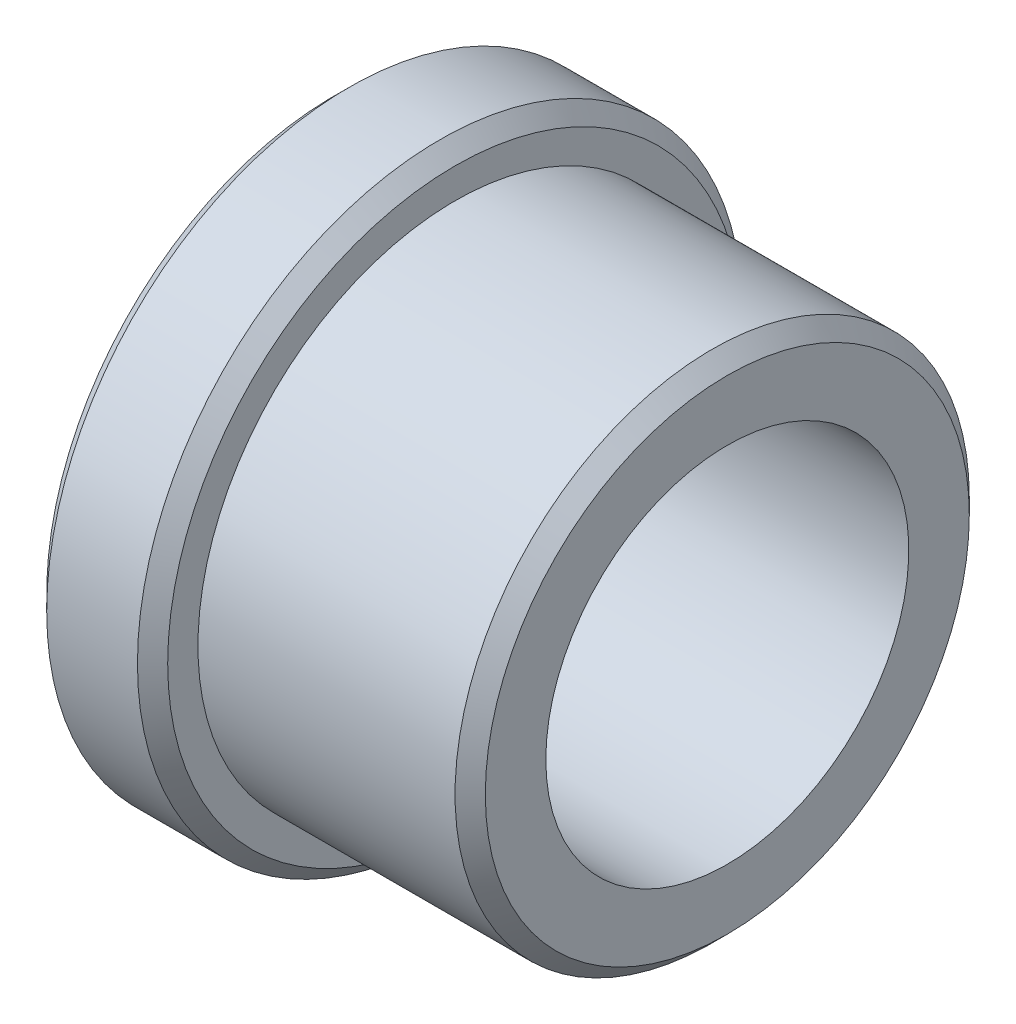
ISO-10303-21;
HEADER;
FILE_DESCRIPTION(('STEP AP214'),'2;1');
FILE_NAME('part.step','',(''),(''),'','','');
FILE_SCHEMA(('AUTOMOTIVE_DESIGN { 1 0 10303 214 1 1 1 1 }'));
ENDSEC;
DATA;
#1=APPLICATION_CONTEXT('core data for automotive mechanical design processes');
#2=APPLICATION_PROTOCOL_DEFINITION('international standard','automotive_design',2000,#1);
#3=PRODUCT_CONTEXT('',#1,'mechanical');
#4=PRODUCT('Part','Part','',(#3));
#5=PRODUCT_RELATED_PRODUCT_CATEGORY('part','',(#4));
#6=PRODUCT_DEFINITION_FORMATION('','',#4);
#7=PRODUCT_DEFINITION_CONTEXT('part definition',#1,'design');
#8=PRODUCT_DEFINITION('design','',#6,#7);
#9=PRODUCT_DEFINITION_SHAPE('','',#8);
#10=(LENGTH_UNIT() NAMED_UNIT(*) SI_UNIT(.MILLI.,.METRE.));
#11=(NAMED_UNIT(*) PLANE_ANGLE_UNIT() SI_UNIT($,.RADIAN.));
#12=(NAMED_UNIT(*) SI_UNIT($,.STERADIAN.) SOLID_ANGLE_UNIT());
#13=UNCERTAINTY_MEASURE_WITH_UNIT(LENGTH_MEASURE(1.E-05),#10,'distance_accuracy_value','');
#14=(GEOMETRIC_REPRESENTATION_CONTEXT(3) GLOBAL_UNCERTAINTY_ASSIGNED_CONTEXT((#13)) GLOBAL_UNIT_ASSIGNED_CONTEXT((#10,
#11,#12)) REPRESENTATION_CONTEXT('',''));
#15=CARTESIAN_POINT('',(0.,0.,0.));
#16=DIRECTION('',(0.,0.,1.));
#17=DIRECTION('',(1.,0.,0.));
#18=AXIS2_PLACEMENT_3D('',#15,#16,#17);
#19=CARTESIAN_POINT('',(13.,0.,0.));
#20=DIRECTION('',(1.,0.,0.));
#21=DIRECTION('',(0.,0.,-1.));
#22=AXIS2_PLACEMENT_3D('',#19,#20,#21);
#23=PLANE('',#22);
#24=CARTESIAN_POINT('',(13.,0.,0.));
#25=DIRECTION('',(1.,0.,0.));
#26=DIRECTION('',(0.,0.,-1.));
#27=AXIS2_PLACEMENT_3D('',#24,#25,#26);
#28=CIRCLE('',#27,8.);
#29=CARTESIAN_POINT('',(13.,0.,-8.));
#30=VERTEX_POINT('',#29);
#31=EDGE_CURVE('E48',#30,#30,#28,.T.);
#32=ORIENTED_EDGE('',*,*,#31,.T.);
#33=EDGE_LOOP('',(#32));
#34=FACE_BOUND('',#33,.T.);
#35=CARTESIAN_POINT('',(13.,0.,0.));
#36=DIRECTION('',(1.,0.,0.));
#37=DIRECTION('',(0.,0.,-1.));
#38=AXIS2_PLACEMENT_3D('',#35,#36,#37);
#39=CIRCLE('',#38,6.);
#40=CARTESIAN_POINT('',(13.,0.,6.));
#41=VERTEX_POINT('',#40);
#42=EDGE_CURVE('E73',#41,#41,#39,.T.);
#43=ORIENTED_EDGE('',*,*,#42,.F.);
#44=EDGE_LOOP('',(#43));
#45=FACE_BOUND('',#44,.T.);
#46=ADVANCED_FACE('F40',(#34,#45),#23,.T.);
#47=CARTESIAN_POINT('',(13.,0.,0.));
#48=DIRECTION('',(-1.,0.,0.));
#49=DIRECTION('',(0.,0.,1.));
#50=AXIS2_PLACEMENT_3D('',#47,#48,#49);
#51=CYLINDRICAL_SURFACE('',#50,10.);
#52=CARTESIAN_POINT('',(0.500000000000016,0.,0.));
#53=DIRECTION('',(1.,0.,0.));
#54=DIRECTION('',(0.,0.,-1.));
#55=AXIS2_PLACEMENT_3D('',#52,#53,#54);
#56=CIRCLE('',#55,10.);
#57=CARTESIAN_POINT('',(0.500000000000014,0.,10.));
#58=VERTEX_POINT('',#57);
#59=EDGE_CURVE('E56',#58,#58,#56,.T.);
#60=CARTESIAN_POINT('',(3.50000000000001,0.,0.));
#61=DIRECTION('',(1.,0.,0.));
#62=DIRECTION('',(0.,0.,-1.));
#63=AXIS2_PLACEMENT_3D('',#60,#61,#62);
#64=CIRCLE('',#63,10.);
#65=CARTESIAN_POINT('',(3.50000000000001,0.,10.));
#66=VERTEX_POINT('',#65);
#67=EDGE_CURVE('E61',#66,#66,#64,.F.);
#68=CARTESIAN_POINT('',(0.500000000000014,0.,10.));
#69=CARTESIAN_POINT('',(0.531250000000014,0.,10.));
#70=CARTESIAN_POINT('',(0.562500000000014,0.,10.));
#71=CARTESIAN_POINT('',(0.625000000000014,0.,10.));
#72=CARTESIAN_POINT('',(0.656250000000014,0.,10.));
#73=CARTESIAN_POINT('',(0.718750000000015,0.,10.));
#74=CARTESIAN_POINT('',(0.750000000000015,0.,10.));
#75=CARTESIAN_POINT('',(0.812500000000015,0.,10.));
#76=CARTESIAN_POINT('',(0.843750000000015,0.,10.));
#77=CARTESIAN_POINT('',(0.906250000000015,0.,10.));
#78=CARTESIAN_POINT('',(0.937500000000015,0.,10.));
#79=CARTESIAN_POINT('',(1.00000000000001,0.,10.));
#80=CARTESIAN_POINT('',(1.03125000000001,0.,10.));
#81=CARTESIAN_POINT('',(1.09375000000001,0.,10.));
#82=CARTESIAN_POINT('',(1.12500000000001,0.,10.));
#83=CARTESIAN_POINT('',(1.18750000000001,0.,10.));
#84=CARTESIAN_POINT('',(1.21875000000001,0.,10.));
#85=CARTESIAN_POINT('',(1.28125000000001,0.,10.));
#86=CARTESIAN_POINT('',(1.31250000000001,0.,10.));
#87=CARTESIAN_POINT('',(1.37500000000001,0.,10.));
#88=CARTESIAN_POINT('',(1.40625000000001,0.,10.));
#89=CARTESIAN_POINT('',(1.46875000000001,0.,10.));
#90=CARTESIAN_POINT('',(1.50000000000001,0.,10.));
#91=CARTESIAN_POINT('',(1.56250000000001,0.,10.));
#92=CARTESIAN_POINT('',(1.59375000000001,0.,10.));
#93=CARTESIAN_POINT('',(1.65625000000001,0.,10.));
#94=CARTESIAN_POINT('',(1.68750000000001,0.,10.));
#95=CARTESIAN_POINT('',(1.75000000000001,0.,10.));
#96=CARTESIAN_POINT('',(1.78125000000001,0.,10.));
#97=CARTESIAN_POINT('',(1.84375000000001,0.,10.));
#98=CARTESIAN_POINT('',(1.87500000000001,0.,10.));
#99=CARTESIAN_POINT('',(1.93750000000001,0.,10.));
#100=CARTESIAN_POINT('',(1.96875000000001,0.,10.));
#101=CARTESIAN_POINT('',(2.03125000000001,0.,10.));
#102=CARTESIAN_POINT('',(2.06250000000001,0.,10.));
#103=CARTESIAN_POINT('',(2.12500000000001,0.,10.));
#104=CARTESIAN_POINT('',(2.15625000000001,0.,10.));
#105=CARTESIAN_POINT('',(2.21875000000001,0.,10.));
#106=CARTESIAN_POINT('',(2.25000000000001,0.,10.));
#107=CARTESIAN_POINT('',(2.31250000000001,0.,10.));
#108=CARTESIAN_POINT('',(2.34375000000001,0.,10.));
#109=CARTESIAN_POINT('',(2.40625000000001,0.,10.));
#110=CARTESIAN_POINT('',(2.43750000000001,0.,10.));
#111=CARTESIAN_POINT('',(2.50000000000001,0.,10.));
#112=CARTESIAN_POINT('',(2.53125000000001,0.,10.));
#113=CARTESIAN_POINT('',(2.59375000000001,0.,10.));
#114=CARTESIAN_POINT('',(2.62500000000001,0.,10.));
#115=CARTESIAN_POINT('',(2.68750000000001,0.,10.));
#116=CARTESIAN_POINT('',(2.71875000000001,0.,10.));
#117=CARTESIAN_POINT('',(2.78125000000001,0.,10.));
#118=CARTESIAN_POINT('',(2.81250000000001,0.,10.));
#119=CARTESIAN_POINT('',(2.87500000000001,0.,10.));
#120=CARTESIAN_POINT('',(2.90625000000001,0.,10.));
#121=CARTESIAN_POINT('',(2.96875000000001,0.,10.));
#122=CARTESIAN_POINT('',(3.00000000000001,0.,10.));
#123=CARTESIAN_POINT('',(3.06250000000001,0.,10.));
#124=CARTESIAN_POINT('',(3.09375000000001,0.,10.));
#125=CARTESIAN_POINT('',(3.15625000000001,0.,10.));
#126=CARTESIAN_POINT('',(3.18750000000001,0.,10.));
#127=CARTESIAN_POINT('',(3.25000000000001,0.,10.));
#128=CARTESIAN_POINT('',(3.28125000000001,0.,10.));
#129=CARTESIAN_POINT('',(3.34375000000001,0.,10.));
#130=CARTESIAN_POINT('',(3.37500000000001,0.,10.));
#131=CARTESIAN_POINT('',(3.43750000000001,0.,10.));
#132=CARTESIAN_POINT('',(3.46875000000001,0.,10.));
#133=CARTESIAN_POINT('',(3.50000000000001,0.,10.));
#134=B_SPLINE_CURVE_WITH_KNOTS('',3,(#68,#69,#70,#71,#72,#73,#74,#75,#76,#77,#78,#79,#80,#81,
#82,#83,#84,#85,#86,#87,#88,#89,#90,#91,#92,#93,#94,#95,#96,#97,#98,#99,#100,#101,#102,#103,
#104,#105,#106,#107,#108,#109,#110,#111,#112,#113,#114,#115,#116,#117,#118,#119,#120,#121,#122,
#123,#124,#125,#126,#127,#128,#129,#130,#131,#132,#133),.UNSPECIFIED.,.F.,.F.,(4,2,2,2,2,2,2,2,
2,2,2,2,2,2,2,2,2,2,2,2,2,2,2,2,2,2,2,2,2,2,2,2,4),(0.,0.0937500000000001,0.1875,0.28125,0.375,
0.46875,0.5625,0.656250000000001,0.750000000000001,0.843749999999999,0.937499999999999,1.03125,
1.125,1.21875,1.3125,1.40625,1.5,1.59375,1.6875,1.78125,1.875,1.96875,2.0625,2.15625,2.25,
2.34375,2.4375,2.53125,2.625,2.71875,2.8125,2.90625,3.),.UNSPECIFIED.);
#135=EDGE_CURVE('BSEAM97',#58,#66,#134,.T.);
#136=ORIENTED_EDGE('',*,*,#59,.T.);
#137=ORIENTED_EDGE('',*,*,#67,.T.);
#138=ORIENTED_EDGE('',*,*,#135,.T.);
#139=ORIENTED_EDGE('',*,*,#135,.F.);
#140=EDGE_LOOP('',(#136,#138,#137,#139));
#141=FACE_BOUND('',#140,.T.);
#142=ADVANCED_FACE('F97',(#141),#51,.T.);
#143=CARTESIAN_POINT('',(0.,0.,0.));
#144=DIRECTION('',(1.,0.,0.));
#145=DIRECTION('',(0.,0.,-1.));
#146=AXIS2_PLACEMENT_3D('',#143,#144,#145);
#147=PLANE('',#146);
#148=CARTESIAN_POINT('',(0.,0.,0.));
#149=DIRECTION('',(1.,0.,0.));
#150=DIRECTION('',(0.,0.,-1.));
#151=AXIS2_PLACEMENT_3D('',#148,#149,#150);
#152=CIRCLE('',#151,6.49999999999999);
#153=CARTESIAN_POINT('',(0.,0.,-6.49999999999999));
#154=VERTEX_POINT('',#153);
#155=EDGE_CURVE('E67',#154,#154,#152,.T.);
#156=ORIENTED_EDGE('',*,*,#155,.T.);
#157=EDGE_LOOP('',(#156));
#158=FACE_BOUND('',#157,.T.);
#159=CARTESIAN_POINT('',(0.,0.,0.));
#160=DIRECTION('',(1.,0.,0.));
#161=DIRECTION('',(0.,0.,-1.));
#162=AXIS2_PLACEMENT_3D('',#159,#160,#161);
#163=CIRCLE('',#162,9.49999999999998);
#164=CARTESIAN_POINT('',(0.,0.,-9.49999999999998));
#165=VERTEX_POINT('',#164);
#166=EDGE_CURVE('E70',#165,#165,#163,.F.);
#167=ORIENTED_EDGE('',*,*,#166,.T.);
#168=EDGE_LOOP('',(#167));
#169=FACE_BOUND('',#168,.T.);
#170=ADVANCED_FACE('F93',(#158,#169),#147,.F.);
#171=CARTESIAN_POINT('',(13.,0.,0.));
#172=DIRECTION('',(-1.,0.,0.));
#173=DIRECTION('',(0.,0.,1.));
#174=AXIS2_PLACEMENT_3D('',#171,#172,#173);
#175=CYLINDRICAL_SURFACE('',#174,6.);
#176=CARTESIAN_POINT('',(0.499999999999988,0.,0.));
#177=DIRECTION('',(1.,0.,0.));
#178=DIRECTION('',(0.,0.,-1.));
#179=AXIS2_PLACEMENT_3D('',#176,#177,#178);
#180=CIRCLE('',#179,6.);
#181=CARTESIAN_POINT('',(0.499999999999987,0.,6.));
#182=VERTEX_POINT('',#181);
#183=EDGE_CURVE('E64',#182,#182,#180,.F.);
#184=CARTESIAN_POINT('',(0.499999999999987,0.,6.));
#185=CARTESIAN_POINT('',(0.63020833333332,0.,6.));
#186=CARTESIAN_POINT('',(0.760416666666654,0.,6.));
#187=CARTESIAN_POINT('',(1.02083333333332,0.,6.));
#188=CARTESIAN_POINT('',(1.15104166666665,0.,6.));
#189=CARTESIAN_POINT('',(1.41145833333332,0.,6.));
#190=CARTESIAN_POINT('',(1.54166666666665,0.,6.));
#191=CARTESIAN_POINT('',(1.80208333333332,0.,6.));
#192=CARTESIAN_POINT('',(1.93229166666665,0.,6.));
#193=CARTESIAN_POINT('',(2.19270833333332,0.,6.));
#194=CARTESIAN_POINT('',(2.32291666666665,0.,6.));
#195=CARTESIAN_POINT('',(2.58333333333332,0.,6.));
#196=CARTESIAN_POINT('',(2.71354166666666,0.,6.));
#197=CARTESIAN_POINT('',(2.97395833333332,0.,6.));
#198=CARTESIAN_POINT('',(3.10416666666666,0.,6.));
#199=CARTESIAN_POINT('',(3.36458333333332,0.,6.));
#200=CARTESIAN_POINT('',(3.49479166666666,0.,6.));
#201=CARTESIAN_POINT('',(3.75520833333332,0.,6.));
#202=CARTESIAN_POINT('',(3.88541666666666,0.,6.));
#203=CARTESIAN_POINT('',(4.14583333333332,0.,6.));
#204=CARTESIAN_POINT('',(4.27604166666666,0.,6.));
#205=CARTESIAN_POINT('',(4.53645833333332,0.,6.));
#206=CARTESIAN_POINT('',(4.66666666666666,0.,6.));
#207=CARTESIAN_POINT('',(4.92708333333333,0.,6.));
#208=CARTESIAN_POINT('',(5.05729166666666,0.,6.));
#209=CARTESIAN_POINT('',(5.31770833333333,0.,6.));
#210=CARTESIAN_POINT('',(5.44791666666666,0.,6.));
#211=CARTESIAN_POINT('',(5.70833333333333,0.,6.));
#212=CARTESIAN_POINT('',(5.83854166666666,0.,6.));
#213=CARTESIAN_POINT('',(6.09895833333333,0.,6.));
#214=CARTESIAN_POINT('',(6.22916666666666,0.,6.));
#215=CARTESIAN_POINT('',(6.48958333333333,0.,6.));
#216=CARTESIAN_POINT('',(6.61979166666666,0.,6.));
#217=CARTESIAN_POINT('',(6.88020833333333,0.,6.));
#218=CARTESIAN_POINT('',(7.01041666666666,0.,6.));
#219=CARTESIAN_POINT('',(7.27083333333333,0.,6.));
#220=CARTESIAN_POINT('',(7.40104166666666,0.,6.));
#221=CARTESIAN_POINT('',(7.66145833333333,0.,6.));
#222=CARTESIAN_POINT('',(7.79166666666666,0.,6.));
#223=CARTESIAN_POINT('',(8.05208333333333,0.,6.));
#224=CARTESIAN_POINT('',(8.18229166666666,0.,6.));
#225=CARTESIAN_POINT('',(8.44270833333333,0.,6.));
#226=CARTESIAN_POINT('',(8.57291666666666,0.,6.));
#227=CARTESIAN_POINT('',(8.83333333333333,0.,6.));
#228=CARTESIAN_POINT('',(8.96354166666666,0.,6.));
#229=CARTESIAN_POINT('',(9.22395833333333,0.,6.));
#230=CARTESIAN_POINT('',(9.35416666666666,0.,6.));
#231=CARTESIAN_POINT('',(9.61458333333333,0.,6.));
#232=CARTESIAN_POINT('',(9.74479166666666,0.,6.));
#233=CARTESIAN_POINT('',(10.0052083333333,0.,6.));
#234=CARTESIAN_POINT('',(10.1354166666667,0.,6.));
#235=CARTESIAN_POINT('',(10.3958333333333,0.,6.));
#236=CARTESIAN_POINT('',(10.5260416666667,0.,6.));
#237=CARTESIAN_POINT('',(10.7864583333333,0.,6.));
#238=CARTESIAN_POINT('',(10.9166666666667,0.,6.));
#239=CARTESIAN_POINT('',(11.1770833333333,0.,6.));
#240=CARTESIAN_POINT('',(11.3072916666667,0.,6.));
#241=CARTESIAN_POINT('',(11.5677083333333,0.,6.));
#242=CARTESIAN_POINT('',(11.6979166666667,0.,6.));
#243=CARTESIAN_POINT('',(11.9583333333333,0.,6.));
#244=CARTESIAN_POINT('',(12.0885416666667,0.,6.));
#245=CARTESIAN_POINT('',(12.3489583333333,0.,6.));
#246=CARTESIAN_POINT('',(12.4791666666667,0.,6.));
#247=CARTESIAN_POINT('',(12.7395833333333,0.,6.));
#248=CARTESIAN_POINT('',(12.8697916666667,0.,6.));
#249=CARTESIAN_POINT('',(13.,0.,6.));
#250=B_SPLINE_CURVE_WITH_KNOTS('',3,(#184,#185,#186,#187,#188,#189,#190,#191,#192,#193,#194,
#195,#196,#197,#198,#199,#200,#201,#202,#203,#204,#205,#206,#207,#208,#209,#210,#211,#212,#213,
#214,#215,#216,#217,#218,#219,#220,#221,#222,#223,#224,#225,#226,#227,#228,#229,#230,#231,#232,
#233,#234,#235,#236,#237,#238,#239,#240,#241,#242,#243,#244,#245,#246,#247,#248,#249),
.UNSPECIFIED.,.F.,.F.,(4,2,2,2,2,2,2,2,2,2,2,2,2,2,2,2,2,2,2,2,2,2,2,2,2,2,2,2,2,2,2,2,4),(0.,
0.390625,0.781250000000001,1.171875,1.5625,1.953125,2.34375,2.734375,3.125,3.515625,3.90625,
4.29687500000001,4.68750000000001,5.07812500000001,5.46875000000001,5.85937500000001,
6.25000000000001,6.64062500000001,7.03125000000001,7.42187500000001,7.81250000000001,
8.20312500000001,8.59375000000001,8.98437500000001,9.37500000000001,9.76562500000001,10.15625,
10.546875,10.9375,11.328125,11.71875,12.109375,12.5),.UNSPECIFIED.);
#251=EDGE_CURVE('BSEAM84',#182,#41,#250,.T.);
#252=ORIENTED_EDGE('',*,*,#183,.T.);
#253=ORIENTED_EDGE('',*,*,#42,.T.);
#254=ORIENTED_EDGE('',*,*,#251,.T.);
#255=ORIENTED_EDGE('',*,*,#251,.F.);
#256=EDGE_LOOP('',(#252,#254,#253,#255));
#257=FACE_BOUND('',#256,.T.);
#258=ADVANCED_FACE('F84',(#257),#175,.F.);
#259=CARTESIAN_POINT('',(4.,0.,0.));
#260=DIRECTION('',(1.,0.,0.));
#261=DIRECTION('',(0.,0.,-1.));
#262=AXIS2_PLACEMENT_3D('',#259,#260,#261);
#263=PLANE('',#262);
#264=CARTESIAN_POINT('',(4.,0.,0.));
#265=DIRECTION('',(1.,0.,0.));
#266=DIRECTION('',(0.,0.,-1.));
#267=AXIS2_PLACEMENT_3D('',#264,#265,#266);
#268=CIRCLE('',#267,9.50000000000002);
#269=CARTESIAN_POINT('',(4.,0.,-9.50000000000002));
#270=VERTEX_POINT('',#269);
#271=EDGE_CURVE('E52',#270,#270,#268,.T.);
#272=ORIENTED_EDGE('',*,*,#271,.T.);
#273=EDGE_LOOP('',(#272));
#274=FACE_BOUND('',#273,.T.);
#275=CARTESIAN_POINT('',(4.,0.,0.));
#276=DIRECTION('',(1.,0.,0.));
#277=DIRECTION('',(0.,0.,-1.));
#278=AXIS2_PLACEMENT_3D('',#275,#276,#277);
#279=CIRCLE('',#278,8.5);
#280=CARTESIAN_POINT('',(4.,0.,-8.5));
#281=VERTEX_POINT('',#280);
#282=EDGE_CURVE('E76',#281,#281,#279,.T.);
#283=ORIENTED_EDGE('',*,*,#282,.F.);
#284=EDGE_LOOP('',(#283));
#285=FACE_BOUND('',#284,.T.);
#286=ADVANCED_FACE('F82',(#274,#285),#263,.T.);
#287=CARTESIAN_POINT('',(4.,0.,0.));
#288=DIRECTION('',(1.,0.,0.));
#289=DIRECTION('',(0.,0.,-1.));
#290=AXIS2_PLACEMENT_3D('',#287,#288,#289);
#291=CYLINDRICAL_SURFACE('',#290,8.5);
#292=CARTESIAN_POINT('',(12.5,0.,0.));
#293=DIRECTION('',(1.,0.,0.));
#294=DIRECTION('',(0.,0.,-1.));
#295=AXIS2_PLACEMENT_3D('',#292,#293,#294);
#296=CIRCLE('',#295,8.5);
#297=CARTESIAN_POINT('',(12.5,0.,-8.5));
#298=VERTEX_POINT('',#297);
#299=EDGE_CURVE('E11',#298,#298,#296,.F.);
#300=ORIENTED_EDGE('',*,*,#299,.T.);
#301=EDGE_LOOP('',(#300));
#302=FACE_BOUND('',#301,.T.);
#303=ORIENTED_EDGE('',*,*,#282,.T.);
#304=EDGE_LOOP('',(#303));
#305=FACE_BOUND('',#304,.T.);
#306=ADVANCED_FACE('F80',(#302,#305),#291,.T.);
#307=CARTESIAN_POINT('',(0.,0.,0.));
#308=DIRECTION('',(-1.,0.,0.));
#309=DIRECTION('',(0.,0.,1.));
#310=AXIS2_PLACEMENT_3D('',#307,#308,#309);
#311=CONICAL_SURFACE('',#310,6.49999999999999,0.78539816339745);
#312=ORIENTED_EDGE('',*,*,#183,.F.);
#313=EDGE_LOOP('',(#312));
#314=FACE_BOUND('',#313,.T.);
#315=ORIENTED_EDGE('',*,*,#155,.F.);
#316=EDGE_LOOP('',(#315));
#317=FACE_BOUND('',#316,.T.);
#318=ADVANCED_FACE('F91',(#314,#317),#311,.F.);
#319=CARTESIAN_POINT('',(0.500000000000016,0.,0.));
#320=DIRECTION('',(1.,0.,0.));
#321=DIRECTION('',(0.,0.,-1.));
#322=AXIS2_PLACEMENT_3D('',#319,#320,#321);
#323=CONICAL_SURFACE('',#322,10.,0.78539816339745);
#324=ORIENTED_EDGE('',*,*,#166,.F.);
#325=EDGE_LOOP('',(#324));
#326=FACE_BOUND('',#325,.T.);
#327=ORIENTED_EDGE('',*,*,#59,.F.);
#328=EDGE_LOOP('',(#327));
#329=FACE_BOUND('',#328,.T.);
#330=ADVANCED_FACE('F115',(#326,#329),#323,.T.);
#331=CARTESIAN_POINT('',(4.,0.,0.));
#332=DIRECTION('',(-1.,0.,0.));
#333=DIRECTION('',(0.,0.,1.));
#334=AXIS2_PLACEMENT_3D('',#331,#332,#333);
#335=CONICAL_SURFACE('',#334,9.50000000000002,0.785398163397441);
#336=ORIENTED_EDGE('',*,*,#67,.F.);
#337=EDGE_LOOP('',(#336));
#338=FACE_BOUND('',#337,.T.);
#339=ORIENTED_EDGE('',*,*,#271,.F.);
#340=EDGE_LOOP('',(#339));
#341=FACE_BOUND('',#340,.T.);
#342=ADVANCED_FACE('F121',(#338,#341),#335,.T.);
#343=CARTESIAN_POINT('',(13.,0.,0.));
#344=DIRECTION('',(-1.,0.,0.));
#345=DIRECTION('',(0.,0.,1.));
#346=AXIS2_PLACEMENT_3D('',#343,#344,#345);
#347=CONICAL_SURFACE('',#346,8.,0.785398163397448);
#348=ORIENTED_EDGE('',*,*,#299,.F.);
#349=EDGE_LOOP('',(#348));
#350=FACE_BOUND('',#349,.T.);
#351=ORIENTED_EDGE('',*,*,#31,.F.);
#352=EDGE_LOOP('',(#351));
#353=FACE_BOUND('',#352,.T.);
#354=ADVANCED_FACE('F43',(#350,#353),#347,.T.);
#355=CLOSED_SHELL('',(#46,#142,#170,#258,#286,#306,#318,#330,#342,#354));
#356=MANIFOLD_SOLID_BREP('B2',#355);
#357=ADVANCED_BREP_SHAPE_REPRESENTATION('',(#18,#356),#14);
#358=SHAPE_DEFINITION_REPRESENTATION(#9,#357);
ENDSEC;
END-ISO-10303-21;
